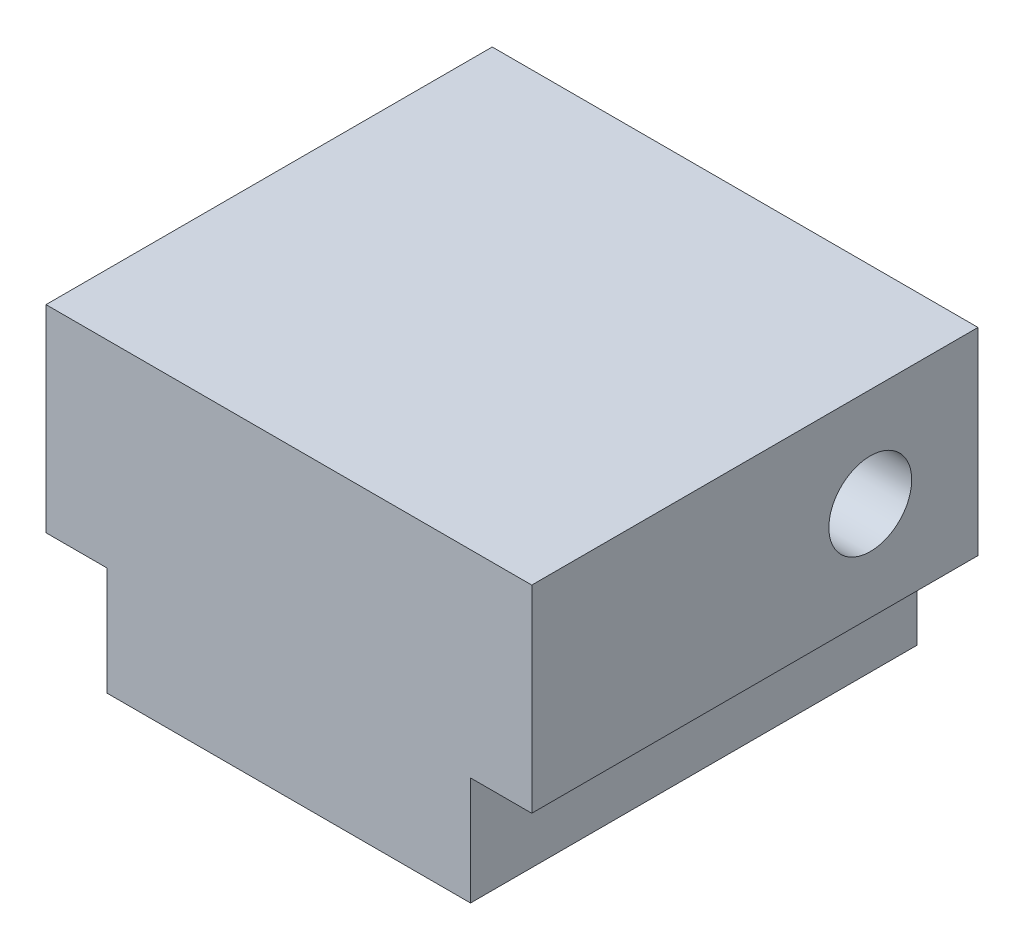
ISO-10303-21;
HEADER;
FILE_DESCRIPTION(('STEP AP214'),'2;1');
FILE_NAME('part.step','',(''),(''),'','','');
FILE_SCHEMA(('AUTOMOTIVE_DESIGN { 1 0 10303 214 1 1 1 1 }'));
ENDSEC;
DATA;
#1=APPLICATION_CONTEXT('core data for automotive mechanical design processes');
#2=APPLICATION_PROTOCOL_DEFINITION('international standard','automotive_design',2000,#1);
#3=PRODUCT_CONTEXT('',#1,'mechanical');
#4=PRODUCT('Part','Part','',(#3));
#5=PRODUCT_RELATED_PRODUCT_CATEGORY('part','',(#4));
#6=PRODUCT_DEFINITION_FORMATION('','',#4);
#7=PRODUCT_DEFINITION_CONTEXT('part definition',#1,'design');
#8=PRODUCT_DEFINITION('design','',#6,#7);
#9=PRODUCT_DEFINITION_SHAPE('','',#8);
#10=(LENGTH_UNIT() NAMED_UNIT(*) SI_UNIT(.MILLI.,.METRE.));
#11=(NAMED_UNIT(*) PLANE_ANGLE_UNIT() SI_UNIT($,.RADIAN.));
#12=(NAMED_UNIT(*) SI_UNIT($,.STERADIAN.) SOLID_ANGLE_UNIT());
#13=UNCERTAINTY_MEASURE_WITH_UNIT(LENGTH_MEASURE(1.E-05),#10,'distance_accuracy_value','');
#14=(GEOMETRIC_REPRESENTATION_CONTEXT(3) GLOBAL_UNCERTAINTY_ASSIGNED_CONTEXT((#13)) GLOBAL_UNIT_ASSIGNED_CONTEXT((#10,
#11,#12)) REPRESENTATION_CONTEXT('',''));
#15=CARTESIAN_POINT('',(0.,0.,0.));
#16=DIRECTION('',(0.,0.,1.));
#17=DIRECTION('',(1.,0.,0.));
#18=AXIS2_PLACEMENT_3D('',#15,#16,#17);
#19=CARTESIAN_POINT('',(-38.1,0.,35.));
#20=DIRECTION('',(0.,1.,0.));
#21=DIRECTION('',(0.,0.,1.));
#22=AXIS2_PLACEMENT_3D('',#19,#20,#21);
#23=PLANE('',#22);
#24=DIRECTION('',(0.,0.,-1.));
#25=VECTOR('',#24,1.);
#26=CARTESIAN_POINT('',(-28.4945191510253,0.,35.));
#27=LINE('',#26,#25);
#28=CARTESIAN_POINT('',(-28.4945191510253,0.,35.));
#29=VERTEX_POINT('',#28);
#30=CARTESIAN_POINT('',(-28.4945191510253,0.,-35.));
#31=VERTEX_POINT('',#30);
#32=EDGE_CURVE('E51',#29,#31,#27,.T.);
#33=ORIENTED_EDGE('',*,*,#32,.F.);
#34=DIRECTION('',(1.,0.,0.));
#35=VECTOR('',#34,1.);
#36=CARTESIAN_POINT('',(-38.1,0.,35.));
#37=LINE('',#36,#35);
#38=CARTESIAN_POINT('',(-38.1,0.,35.));
#39=VERTEX_POINT('',#38);
#40=EDGE_CURVE('E157',#39,#29,#37,.T.);
#41=ORIENTED_EDGE('',*,*,#40,.F.);
#42=DIRECTION('',(0.,0.,1.));
#43=VECTOR('',#42,1.);
#44=CARTESIAN_POINT('',(-38.1,0.,-35.));
#45=LINE('',#44,#43);
#46=CARTESIAN_POINT('',(-38.1,0.,-35.));
#47=VERTEX_POINT('',#46);
#48=EDGE_CURVE('E162',#47,#39,#45,.T.);
#49=ORIENTED_EDGE('',*,*,#48,.F.);
#50=DIRECTION('',(-1.,0.,0.));
#51=VECTOR('',#50,1.);
#52=CARTESIAN_POINT('',(-38.1,0.,-35.));
#53=LINE('',#52,#51);
#54=EDGE_CURVE('E56',#31,#47,#53,.T.);
#55=ORIENTED_EDGE('',*,*,#54,.F.);
#56=EDGE_LOOP('',(#33,#41,#49,#55));
#57=FACE_BOUND('',#56,.T.);
#58=ADVANCED_FACE('F34',(#57),#23,.F.);
#59=DIRECTION('',(0.,0.,1.));
#60=VECTOR('',#59,1.);
#61=CARTESIAN_POINT('',(28.4945191510253,0.,35.));
#62=LINE('',#61,#60);
#63=CARTESIAN_POINT('',(28.4945191510253,0.,-35.));
#64=VERTEX_POINT('',#63);
#65=CARTESIAN_POINT('',(28.4945191510253,0.,35.));
#66=VERTEX_POINT('',#65);
#67=EDGE_CURVE('E119',#64,#66,#62,.T.);
#68=ORIENTED_EDGE('',*,*,#67,.F.);
#69=CARTESIAN_POINT('',(38.1,0.,-35.));
#70=VERTEX_POINT('',#69);
#71=EDGE_CURVE('E175',#70,#64,#53,.T.);
#72=ORIENTED_EDGE('',*,*,#71,.F.);
#73=DIRECTION('',(0.,0.,-1.));
#74=VECTOR('',#73,1.);
#75=CARTESIAN_POINT('',(38.1,0.,-35.));
#76=LINE('',#75,#74);
#77=CARTESIAN_POINT('',(38.1,0.,35.));
#78=VERTEX_POINT('',#77);
#79=EDGE_CURVE('E160',#78,#70,#76,.T.);
#80=ORIENTED_EDGE('',*,*,#79,.F.);
#81=EDGE_CURVE('E146',#66,#78,#37,.T.);
#82=ORIENTED_EDGE('',*,*,#81,.F.);
#83=EDGE_LOOP('',(#68,#72,#80,#82));
#84=FACE_BOUND('',#83,.T.);
#85=ADVANCED_FACE('F215',(#84),#23,.F.);
#86=CARTESIAN_POINT('',(-38.1,31.,-35.));
#87=DIRECTION('',(1.,0.,0.));
#88=DIRECTION('',(0.,0.,-1.));
#89=AXIS2_PLACEMENT_3D('',#86,#87,#88);
#90=PLANE('',#89);
#91=CARTESIAN_POINT('',(-38.1,15.5,-18.1));
#92=DIRECTION('',(1.,0.,0.));
#93=DIRECTION('',(0.,0.,-1.));
#94=AXIS2_PLACEMENT_3D('',#91,#92,#93);
#95=CIRCLE('',#94,6.5);
#96=CARTESIAN_POINT('',(-38.1,15.5,-24.6));
#97=VERTEX_POINT('',#96);
#98=EDGE_CURVE('E125',#97,#97,#95,.T.);
#99=ORIENTED_EDGE('',*,*,#98,.T.);
#100=EDGE_LOOP('',(#99));
#101=FACE_BOUND('',#100,.T.);
#102=ORIENTED_EDGE('',*,*,#48,.T.);
#103=DIRECTION('',(0.,-1.,0.));
#104=VECTOR('',#103,1.);
#105=CARTESIAN_POINT('',(-38.1,31.,35.));
#106=LINE('',#105,#104);
#107=CARTESIAN_POINT('',(-38.1,31.,35.));
#108=VERTEX_POINT('',#107);
#109=EDGE_CURVE('E11',#108,#39,#106,.T.);
#110=ORIENTED_EDGE('',*,*,#109,.F.);
#111=DIRECTION('',(0.,0.,1.));
#112=VECTOR('',#111,1.);
#113=CARTESIAN_POINT('',(-38.1,31.,-35.));
#114=LINE('',#113,#112);
#115=CARTESIAN_POINT('',(-38.1,31.,-35.));
#116=VERTEX_POINT('',#115);
#117=EDGE_CURVE('E176',#116,#108,#114,.T.);
#118=ORIENTED_EDGE('',*,*,#117,.F.);
#119=DIRECTION('',(0.,-1.,0.));
#120=VECTOR('',#119,1.);
#121=CARTESIAN_POINT('',(-38.1,31.,-35.));
#122=LINE('',#121,#120);
#123=EDGE_CURVE('E172',#116,#47,#122,.T.);
#124=ORIENTED_EDGE('',*,*,#123,.T.);
#125=EDGE_LOOP('',(#102,#110,#118,#124));
#126=FACE_BOUND('',#125,.T.);
#127=ADVANCED_FACE('F36',(#101,#126),#90,.F.);
#128=CARTESIAN_POINT('',(-38.1,31.,35.));
#129=DIRECTION('',(0.,0.,-1.));
#130=DIRECTION('',(-1.,0.,0.));
#131=AXIS2_PLACEMENT_3D('',#128,#129,#130);
#132=PLANE('',#131);
#133=ORIENTED_EDGE('',*,*,#40,.T.);
#134=DIRECTION('',(0.,1.,0.));
#135=VECTOR('',#134,1.);
#136=CARTESIAN_POINT('',(-28.4945191510253,-17.,35.));
#137=LINE('',#136,#135);
#138=CARTESIAN_POINT('',(-28.4945191510253,-17.,35.));
#139=VERTEX_POINT('',#138);
#140=EDGE_CURVE('E135',#139,#29,#137,.T.);
#141=ORIENTED_EDGE('',*,*,#140,.F.);
#142=DIRECTION('',(-1.,0.,0.));
#143=VECTOR('',#142,1.);
#144=CARTESIAN_POINT('',(-28.4945191510253,-17.,35.));
#145=LINE('',#144,#143);
#146=CARTESIAN_POINT('',(28.4945191510253,-17.,35.));
#147=VERTEX_POINT('',#146);
#148=EDGE_CURVE('E115',#147,#139,#145,.T.);
#149=ORIENTED_EDGE('',*,*,#148,.F.);
#150=DIRECTION('',(0.,1.,0.));
#151=VECTOR('',#150,1.);
#152=CARTESIAN_POINT('',(28.4945191510253,-17.,35.));
#153=LINE('',#152,#151);
#154=EDGE_CURVE('E127',#147,#66,#153,.T.);
#155=ORIENTED_EDGE('',*,*,#154,.T.);
#156=ORIENTED_EDGE('',*,*,#81,.T.);
#157=DIRECTION('',(0.,-1.,0.));
#158=VECTOR('',#157,1.);
#159=CARTESIAN_POINT('',(38.1,31.,35.));
#160=LINE('',#159,#158);
#161=CARTESIAN_POINT('',(38.1,31.,35.));
#162=VERTEX_POINT('',#161);
#163=EDGE_CURVE('E43',#162,#78,#160,.T.);
#164=ORIENTED_EDGE('',*,*,#163,.F.);
#165=DIRECTION('',(1.,0.,0.));
#166=VECTOR('',#165,1.);
#167=CARTESIAN_POINT('',(-38.1,31.,35.));
#168=LINE('',#167,#166);
#169=EDGE_CURVE('E192',#108,#162,#168,.T.);
#170=ORIENTED_EDGE('',*,*,#169,.F.);
#171=ORIENTED_EDGE('',*,*,#109,.T.);
#172=EDGE_LOOP('',(#133,#141,#149,#155,#156,#164,#170,#171));
#173=FACE_BOUND('',#172,.T.);
#174=ADVANCED_FACE('F156',(#173),#132,.F.);
#175=CARTESIAN_POINT('',(38.1,31.,-35.));
#176=DIRECTION('',(-1.,0.,0.));
#177=DIRECTION('',(0.,0.,1.));
#178=AXIS2_PLACEMENT_3D('',#175,#176,#177);
#179=PLANE('',#178);
#180=CARTESIAN_POINT('',(38.1,15.5,-18.1));
#181=DIRECTION('',(1.,0.,0.));
#182=DIRECTION('',(0.,0.,-1.));
#183=AXIS2_PLACEMENT_3D('',#180,#181,#182);
#184=CIRCLE('',#183,6.5);
#185=CARTESIAN_POINT('',(38.1,15.5,-24.6));
#186=VERTEX_POINT('',#185);
#187=EDGE_CURVE('E122',#186,#186,#184,.T.);
#188=ORIENTED_EDGE('',*,*,#187,.F.);
#189=EDGE_LOOP('',(#188));
#190=FACE_BOUND('',#189,.T.);
#191=ORIENTED_EDGE('',*,*,#79,.T.);
#192=DIRECTION('',(0.,-1.,0.));
#193=VECTOR('',#192,1.);
#194=CARTESIAN_POINT('',(38.1,31.,-35.));
#195=LINE('',#194,#193);
#196=CARTESIAN_POINT('',(38.1,31.,-35.));
#197=VERTEX_POINT('',#196);
#198=EDGE_CURVE('E179',#197,#70,#195,.T.);
#199=ORIENTED_EDGE('',*,*,#198,.F.);
#200=DIRECTION('',(0.,0.,-1.));
#201=VECTOR('',#200,1.);
#202=CARTESIAN_POINT('',(38.1,31.,-35.));
#203=LINE('',#202,#201);
#204=EDGE_CURVE('E189',#162,#197,#203,.T.);
#205=ORIENTED_EDGE('',*,*,#204,.F.);
#206=ORIENTED_EDGE('',*,*,#163,.T.);
#207=EDGE_LOOP('',(#191,#199,#205,#206));
#208=FACE_BOUND('',#207,.T.);
#209=ADVANCED_FACE('F208',(#190,#208),#179,.F.);
#210=CARTESIAN_POINT('',(-38.1,31.,-35.));
#211=DIRECTION('',(0.,0.,1.));
#212=DIRECTION('',(1.,0.,0.));
#213=AXIS2_PLACEMENT_3D('',#210,#211,#212);
#214=PLANE('',#213);
#215=ORIENTED_EDGE('',*,*,#71,.T.);
#216=DIRECTION('',(0.,1.,0.));
#217=VECTOR('',#216,1.);
#218=CARTESIAN_POINT('',(28.4945191510253,-17.,-35.));
#219=LINE('',#218,#217);
#220=CARTESIAN_POINT('',(28.4945191510253,-17.,-35.));
#221=VERTEX_POINT('',#220);
#222=EDGE_CURVE('E106',#221,#64,#219,.T.);
#223=ORIENTED_EDGE('',*,*,#222,.F.);
#224=DIRECTION('',(1.,0.,0.));
#225=VECTOR('',#224,1.);
#226=CARTESIAN_POINT('',(-28.4945191510253,-17.,-35.));
#227=LINE('',#226,#225);
#228=CARTESIAN_POINT('',(-28.4945191510253,-17.,-35.));
#229=VERTEX_POINT('',#228);
#230=EDGE_CURVE('E99',#229,#221,#227,.T.);
#231=ORIENTED_EDGE('',*,*,#230,.F.);
#232=DIRECTION('',(0.,1.,0.));
#233=VECTOR('',#232,1.);
#234=CARTESIAN_POINT('',(-28.4945191510253,-17.,-35.));
#235=LINE('',#234,#233);
#236=EDGE_CURVE('E104',#229,#31,#235,.T.);
#237=ORIENTED_EDGE('',*,*,#236,.T.);
#238=ORIENTED_EDGE('',*,*,#54,.T.);
#239=ORIENTED_EDGE('',*,*,#123,.F.);
#240=DIRECTION('',(-1.,0.,0.));
#241=VECTOR('',#240,1.);
#242=CARTESIAN_POINT('',(-38.1,31.,-35.));
#243=LINE('',#242,#241);
#244=EDGE_CURVE('E185',#197,#116,#243,.T.);
#245=ORIENTED_EDGE('',*,*,#244,.F.);
#246=ORIENTED_EDGE('',*,*,#198,.T.);
#247=EDGE_LOOP('',(#215,#223,#231,#237,#238,#239,#245,#246));
#248=FACE_BOUND('',#247,.T.);
#249=ADVANCED_FACE('F102',(#248),#214,.F.);
#250=CARTESIAN_POINT('',(-38.1,31.,35.));
#251=DIRECTION('',(0.,1.,0.));
#252=DIRECTION('',(0.,0.,1.));
#253=AXIS2_PLACEMENT_3D('',#250,#251,#252);
#254=PLANE('',#253);
#255=ORIENTED_EDGE('',*,*,#117,.T.);
#256=ORIENTED_EDGE('',*,*,#169,.T.);
#257=ORIENTED_EDGE('',*,*,#204,.T.);
#258=ORIENTED_EDGE('',*,*,#244,.T.);
#259=EDGE_LOOP('',(#255,#256,#257,#258));
#260=FACE_BOUND('',#259,.T.);
#261=ADVANCED_FACE('F196',(#260),#254,.T.);
#262=CARTESIAN_POINT('',(-38.1,15.5,-18.1));
#263=DIRECTION('',(1.,0.,0.));
#264=DIRECTION('',(0.,0.,-1.));
#265=AXIS2_PLACEMENT_3D('',#262,#263,#264);
#266=CYLINDRICAL_SURFACE('',#265,6.5);
#267=ORIENTED_EDGE('',*,*,#98,.F.);
#268=EDGE_LOOP('',(#267));
#269=FACE_BOUND('',#268,.T.);
#270=ORIENTED_EDGE('',*,*,#187,.T.);
#271=EDGE_LOOP('',(#270));
#272=FACE_BOUND('',#271,.T.);
#273=ADVANCED_FACE('F202',(#269,#272),#266,.F.);
#274=CARTESIAN_POINT('',(-28.4945191510253,-17.,35.));
#275=DIRECTION('',(1.,0.,0.));
#276=DIRECTION('',(0.,0.,-1.));
#277=AXIS2_PLACEMENT_3D('',#274,#275,#276);
#278=PLANE('',#277);
#279=ORIENTED_EDGE('',*,*,#32,.T.);
#280=ORIENTED_EDGE('',*,*,#236,.F.);
#281=DIRECTION('',(0.,0.,-1.));
#282=VECTOR('',#281,1.);
#283=CARTESIAN_POINT('',(-28.4945191510253,-17.,35.));
#284=LINE('',#283,#282);
#285=EDGE_CURVE('E110',#139,#229,#284,.T.);
#286=ORIENTED_EDGE('',*,*,#285,.F.);
#287=ORIENTED_EDGE('',*,*,#140,.T.);
#288=EDGE_LOOP('',(#279,#280,#286,#287));
#289=FACE_BOUND('',#288,.T.);
#290=ADVANCED_FACE('F121',(#289),#278,.F.);
#291=CARTESIAN_POINT('',(28.4945191510253,-17.,35.));
#292=DIRECTION('',(-1.,0.,0.));
#293=DIRECTION('',(0.,0.,1.));
#294=AXIS2_PLACEMENT_3D('',#291,#292,#293);
#295=PLANE('',#294);
#296=ORIENTED_EDGE('',*,*,#67,.T.);
#297=ORIENTED_EDGE('',*,*,#154,.F.);
#298=DIRECTION('',(0.,0.,1.));
#299=VECTOR('',#298,1.);
#300=CARTESIAN_POINT('',(28.4945191510253,-17.,35.));
#301=LINE('',#300,#299);
#302=EDGE_CURVE('E109',#221,#147,#301,.T.);
#303=ORIENTED_EDGE('',*,*,#302,.F.);
#304=ORIENTED_EDGE('',*,*,#222,.T.);
#305=EDGE_LOOP('',(#296,#297,#303,#304));
#306=FACE_BOUND('',#305,.T.);
#307=ADVANCED_FACE('F155',(#306),#295,.F.);
#308=CARTESIAN_POINT('',(-28.4945191510253,-17.,-35.));
#309=DIRECTION('',(0.,-1.,0.));
#310=DIRECTION('',(0.,0.,-1.));
#311=AXIS2_PLACEMENT_3D('',#308,#309,#310);
#312=PLANE('',#311);
#313=ORIENTED_EDGE('',*,*,#285,.T.);
#314=ORIENTED_EDGE('',*,*,#230,.T.);
#315=ORIENTED_EDGE('',*,*,#302,.T.);
#316=ORIENTED_EDGE('',*,*,#148,.T.);
#317=EDGE_LOOP('',(#313,#314,#315,#316));
#318=FACE_BOUND('',#317,.T.);
#319=ADVANCED_FACE('F113',(#318),#312,.T.);
#320=CLOSED_SHELL('',(#58,#85,#127,#174,#209,#249,#261,#273,#290,#307,#319));
#321=MANIFOLD_SOLID_BREP('B2',#320);
#322=ADVANCED_BREP_SHAPE_REPRESENTATION('',(#18,#321),#14);
#323=SHAPE_DEFINITION_REPRESENTATION(#9,#322);
ENDSEC;
END-ISO-10303-21;
